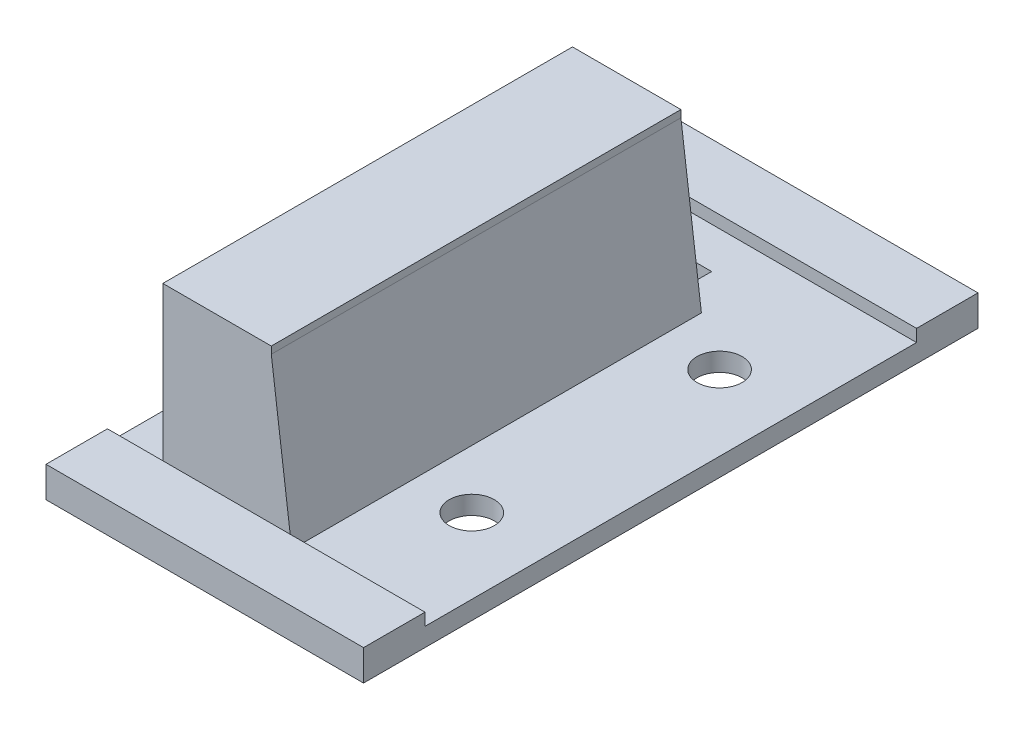
ISO-10303-21;
HEADER;
FILE_DESCRIPTION(('STEP AP214'),'2;1');
FILE_NAME('part.step','',(''),(''),'','','');
FILE_SCHEMA(('AUTOMOTIVE_DESIGN { 1 0 10303 214 1 1 1 1 }'));
ENDSEC;
DATA;
#1=APPLICATION_CONTEXT('core data for automotive mechanical design processes');
#2=APPLICATION_PROTOCOL_DEFINITION('international standard','automotive_design',2000,#1);
#3=PRODUCT_CONTEXT('',#1,'mechanical');
#4=PRODUCT('Part','Part','',(#3));
#5=PRODUCT_RELATED_PRODUCT_CATEGORY('part','',(#4));
#6=PRODUCT_DEFINITION_FORMATION('','',#4);
#7=PRODUCT_DEFINITION_CONTEXT('part definition',#1,'design');
#8=PRODUCT_DEFINITION('design','',#6,#7);
#9=PRODUCT_DEFINITION_SHAPE('','',#8);
#10=(LENGTH_UNIT() NAMED_UNIT(*) SI_UNIT(.MILLI.,.METRE.));
#11=(NAMED_UNIT(*) PLANE_ANGLE_UNIT() SI_UNIT($,.RADIAN.));
#12=(NAMED_UNIT(*) SI_UNIT($,.STERADIAN.) SOLID_ANGLE_UNIT());
#13=UNCERTAINTY_MEASURE_WITH_UNIT(LENGTH_MEASURE(1.E-05),#10,'distance_accuracy_value','');
#14=(GEOMETRIC_REPRESENTATION_CONTEXT(3) GLOBAL_UNCERTAINTY_ASSIGNED_CONTEXT((#13)) GLOBAL_UNIT_ASSIGNED_CONTEXT((#10,
#11,#12)) REPRESENTATION_CONTEXT('',''));
#15=CARTESIAN_POINT('',(0.,0.,0.));
#16=DIRECTION('',(0.,0.,1.));
#17=DIRECTION('',(1.,0.,0.));
#18=AXIS2_PLACEMENT_3D('',#15,#16,#17);
#19=CARTESIAN_POINT('',(0.,0.,-8.509));
#20=DIRECTION('',(0.,0.,-1.));
#21=DIRECTION('',(-1.,0.,0.));
#22=AXIS2_PLACEMENT_3D('',#19,#20,#21);
#23=PLANE('',#22);
#24=DIRECTION('',(0.,1.,0.));
#25=VECTOR('',#24,1.);
#26=CARTESIAN_POINT('',(7.62,0.,-8.509));
#27=LINE('',#26,#25);
#28=CARTESIAN_POINT('',(7.62000000000001,3.81,-8.509));
#29=VERTEX_POINT('',#28);
#30=CARTESIAN_POINT('',(7.62,20.6442671901619,-8.50899999999999));
#31=VERTEX_POINT('',#30);
#32=EDGE_CURVE('E358',#29,#31,#27,.T.);
#33=ORIENTED_EDGE('',*,*,#32,.T.);
#34=DIRECTION('',(0.707106781186557,0.707106781186538,0.));
#35=VECTOR('',#34,1.);
#36=CARTESIAN_POINT('',(-6.51213359508106,6.51213359508124,-8.509));
#37=LINE('',#36,#35);
#38=CARTESIAN_POINT('',(8.94673280983812,21.971,-8.50899999999999));
#39=VERTEX_POINT('',#38);
#40=EDGE_CURVE('E314',#31,#39,#37,.T.);
#41=ORIENTED_EDGE('',*,*,#40,.T.);
#42=DIRECTION('',(1.,0.,0.));
#43=VECTOR('',#42,1.);
#44=CARTESIAN_POINT('',(0.,21.971,-8.509));
#45=LINE('',#44,#43);
#46=CARTESIAN_POINT('',(17.961616695176,21.971,-8.509));
#47=VERTEX_POINT('',#46);
#48=EDGE_CURVE('E365',#39,#47,#45,.T.);
#49=ORIENTED_EDGE('',*,*,#48,.T.);
#50=DIRECTION('',(0.851393399487625,-0.5245276725864,0.));
#51=VECTOR('',#50,1.);
#52=CARTESIAN_POINT('',(14.7535626163669,23.9474225803274,-8.509));
#53=LINE('',#52,#51);
#54=CARTESIAN_POINT('',(19.689000062415,20.9067911656027,-8.509));
#55=VERTEX_POINT('',#54);
#56=EDGE_CURVE('E349',#47,#55,#53,.T.);
#57=ORIENTED_EDGE('',*,*,#56,.T.);
#58=DIRECTION('',(0.127971337630197,-0.991777866634025,0.));
#59=VECTOR('',#58,1.);
#60=CARTESIAN_POINT('',(22.0200318981735,2.841294438474,-8.509));
#61=LINE('',#60,#59);
#62=CARTESIAN_POINT('',(21.8950376321701,3.81,-8.509));
#63=VERTEX_POINT('',#62);
#64=EDGE_CURVE('E367',#55,#63,#61,.T.);
#65=ORIENTED_EDGE('',*,*,#64,.T.);
#66=DIRECTION('',(0.499094844356284,0.866547365316505,0.));
#67=VECTOR('',#66,1.);
#68=CARTESIAN_POINT('',(14.7932943838377,-8.52031551134131,-8.509));
#69=LINE('',#68,#67);
#70=CARTESIAN_POINT('',(21.0172777159293,2.286,-8.509));
#71=VERTEX_POINT('',#70);
#72=EDGE_CURVE('E351',#71,#63,#69,.T.);
#73=ORIENTED_EDGE('',*,*,#72,.F.);
#74=DIRECTION('',(0.,1.,0.));
#75=VECTOR('',#74,1.);
#76=CARTESIAN_POINT('',(21.0172777159293,0.,-8.509));
#77=LINE('',#76,#75);
#78=CARTESIAN_POINT('',(21.0172777159293,0.,-8.509));
#79=VERTEX_POINT('',#78);
#80=EDGE_CURVE('E305',#79,#71,#77,.T.);
#81=ORIENTED_EDGE('',*,*,#80,.F.);
#82=DIRECTION('',(1.,0.,0.));
#83=VECTOR('',#82,1.);
#84=CARTESIAN_POINT('',(21.0172777159293,0.,-8.509));
#85=LINE('',#84,#83);
#86=CARTESIAN_POINT('',(9.14399999999998,0.,-8.509));
#87=VERTEX_POINT('',#86);
#88=EDGE_CURVE('E281',#87,#79,#85,.T.);
#89=ORIENTED_EDGE('',*,*,#88,.F.);
#90=DIRECTION('',(0.,1.,0.));
#91=VECTOR('',#90,1.);
#92=CARTESIAN_POINT('',(9.14399999999998,0.,-8.509));
#93=LINE('',#92,#91);
#94=CARTESIAN_POINT('',(9.14399999999998,2.286,-8.509));
#95=VERTEX_POINT('',#94);
#96=EDGE_CURVE('E307',#87,#95,#93,.T.);
#97=ORIENTED_EDGE('',*,*,#96,.T.);
#98=DIRECTION('',(-0.707106781186542,0.707106781186553,0.));
#99=VECTOR('',#98,1.);
#100=CARTESIAN_POINT('',(5.71500000000006,5.71499999999997,-8.509));
#101=LINE('',#100,#99);
#102=EDGE_CURVE('E91',#95,#29,#101,.T.);
#103=ORIENTED_EDGE('',*,*,#102,.T.);
#104=EDGE_LOOP('',(#33,#41,#49,#57,#65,#73,#81,#89,#97,#103));
#105=FACE_BOUND('',#104,.T.);
#106=ADVANCED_FACE('F83',(#105),#23,.T.);
#107=CARTESIAN_POINT('',(20.32,21.971,-58.42));
#108=DIRECTION('',(0.,1.,0.));
#109=DIRECTION('',(0.,0.,1.));
#110=AXIS2_PLACEMENT_3D('',#107,#108,#109);
#111=PLANE('',#110);
#112=DIRECTION('',(0.,0.,1.));
#113=VECTOR('',#112,1.);
#114=CARTESIAN_POINT('',(8.94673280983812,21.971,-78.705299702025));
#115=LINE('',#114,#113);
#116=CARTESIAN_POINT('',(8.94673280983812,21.971,-58.42));
#117=VERTEX_POINT('',#116);
#118=EDGE_CURVE('E312',#117,#39,#115,.T.);
#119=ORIENTED_EDGE('',*,*,#118,.F.);
#120=DIRECTION('',(-1.,0.,0.));
#121=VECTOR('',#120,1.);
#122=CARTESIAN_POINT('',(20.32,21.971,-58.42));
#123=LINE('',#122,#121);
#124=CARTESIAN_POINT('',(17.961616695176,21.971,-58.42));
#125=VERTEX_POINT('',#124);
#126=EDGE_CURVE('E379',#125,#117,#123,.T.);
#127=ORIENTED_EDGE('',*,*,#126,.F.);
#128=DIRECTION('',(0.,0.,1.));
#129=VECTOR('',#128,1.);
#130=CARTESIAN_POINT('',(17.961616695176,21.971,-78.705299702025));
#131=LINE('',#130,#129);
#132=EDGE_CURVE('E325',#125,#47,#131,.T.);
#133=ORIENTED_EDGE('',*,*,#132,.T.);
#134=ORIENTED_EDGE('',*,*,#48,.F.);
#135=EDGE_LOOP('',(#119,#127,#133,#134));
#136=FACE_BOUND('',#135,.T.);
#137=ADVANCED_FACE('F474',(#136),#111,.F.);
#138=CARTESIAN_POINT('',(7.62000000000001,22.86,0.));
#139=DIRECTION('',(1.,0.,0.));
#140=DIRECTION('',(0.,0.,-1.));
#141=AXIS2_PLACEMENT_3D('',#138,#139,#140);
#142=PLANE('',#141);
#143=DIRECTION('',(0.,-1.,0.));
#144=VECTOR('',#143,1.);
#145=CARTESIAN_POINT('',(7.62,22.86,-58.42));
#146=LINE('',#145,#144);
#147=CARTESIAN_POINT('',(7.62,20.6442671901619,-58.42));
#148=VERTEX_POINT('',#147);
#149=CARTESIAN_POINT('',(7.62,3.81,-58.42));
#150=VERTEX_POINT('',#149);
#151=EDGE_CURVE('E391',#148,#150,#146,.T.);
#152=ORIENTED_EDGE('',*,*,#151,.F.);
#153=DIRECTION('',(0.,0.,1.));
#154=VECTOR('',#153,1.);
#155=CARTESIAN_POINT('',(7.62,20.6442671901619,-78.705299702025));
#156=LINE('',#155,#154);
#157=EDGE_CURVE('E315',#148,#31,#156,.T.);
#158=ORIENTED_EDGE('',*,*,#157,.T.);
#159=ORIENTED_EDGE('',*,*,#32,.F.);
#160=DIRECTION('',(0.,0.,1.));
#161=VECTOR('',#160,1.);
#162=CARTESIAN_POINT('',(7.62,3.81,-78.705299702025));
#163=LINE('',#162,#161);
#164=EDGE_CURVE('E354',#150,#29,#163,.T.);
#165=ORIENTED_EDGE('',*,*,#164,.F.);
#166=EDGE_LOOP('',(#152,#158,#159,#165));
#167=FACE_BOUND('',#166,.T.);
#168=ADVANCED_FACE('F468',(#167),#142,.T.);
#169=CARTESIAN_POINT('',(0.,3.81,-7.62));
#170=DIRECTION('',(0.,0.,1.));
#171=DIRECTION('',(1.,0.,0.));
#172=AXIS2_PLACEMENT_3D('',#169,#170,#171);
#173=PLANE('',#172);
#174=DIRECTION('',(0.127971337630197,-0.991777866634025,0.));
#175=VECTOR('',#174,1.);
#176=CARTESIAN_POINT('',(22.7757666325486,2.93880859774821,-7.62));
#177=LINE('',#176,#175);
#178=CARTESIAN_POINT('',(22.6633548387097,3.81,-7.62));
#179=VERTEX_POINT('',#178);
#180=CARTESIAN_POINT('',(22.86,2.286,-7.62));
#181=VERTEX_POINT('',#180);
#182=EDGE_CURVE('E326',#179,#181,#177,.T.);
#183=ORIENTED_EDGE('',*,*,#182,.F.);
#184=DIRECTION('',(-1.,0.,0.));
#185=VECTOR('',#184,1.);
#186=CARTESIAN_POINT('',(0.,3.81,-7.62));
#187=LINE('',#186,#185);
#188=CARTESIAN_POINT('',(39.3827,3.81,-7.62));
#189=VERTEX_POINT('',#188);
#190=EDGE_CURVE('E528',#189,#179,#187,.T.);
#191=ORIENTED_EDGE('',*,*,#190,.F.);
#192=DIRECTION('',(0.,-1.,0.));
#193=VECTOR('',#192,1.);
#194=CARTESIAN_POINT('',(39.3827,3.81,-7.62));
#195=LINE('',#194,#193);
#196=CARTESIAN_POINT('',(39.3827,2.286,-7.62));
#197=VERTEX_POINT('',#196);
#198=EDGE_CURVE('E458',#189,#197,#195,.T.);
#199=ORIENTED_EDGE('',*,*,#198,.T.);
#200=DIRECTION('',(-1.,0.,0.));
#201=VECTOR('',#200,1.);
#202=CARTESIAN_POINT('',(0.,2.286,-7.62));
#203=LINE('',#202,#201);
#204=EDGE_CURVE('E453',#197,#181,#203,.T.);
#205=ORIENTED_EDGE('',*,*,#204,.T.);
#206=EDGE_LOOP('',(#183,#191,#199,#205));
#207=FACE_BOUND('',#206,.T.);
#208=ADVANCED_FACE('F526',(#207),#173,.F.);
#209=CARTESIAN_POINT('',(0.,2.286,0.));
#210=DIRECTION('',(0.,1.,0.));
#211=DIRECTION('',(0.,0.,1.));
#212=AXIS2_PLACEMENT_3D('',#209,#210,#211);
#213=PLANE('',#212);
#214=DIRECTION('',(-1.,0.,0.));
#215=VECTOR('',#214,1.);
#216=CARTESIAN_POINT('',(9.14399999999998,2.286,-58.42));
#217=LINE('',#216,#215);
#218=CARTESIAN_POINT('',(21.0172777159293,2.286,-58.42));
#219=VERTEX_POINT('',#218);
#220=CARTESIAN_POINT('',(19.05,2.286,-58.42));
#221=VERTEX_POINT('',#220);
#222=EDGE_CURVE('E297',#219,#221,#217,.T.);
#223=ORIENTED_EDGE('',*,*,#222,.F.);
#224=DIRECTION('',(-1.,0.,0.));
#225=VECTOR('',#224,1.);
#226=CARTESIAN_POINT('',(0.,2.286,-58.42));
#227=LINE('',#226,#225);
#228=CARTESIAN_POINT('',(22.86,2.286,-58.42));
#229=VERTEX_POINT('',#228);
#230=EDGE_CURVE('E106',#229,#219,#227,.T.);
#231=ORIENTED_EDGE('',*,*,#230,.F.);
#232=DIRECTION('',(0.,0.,1.));
#233=VECTOR('',#232,1.);
#234=CARTESIAN_POINT('',(22.86,2.286,-78.705299702025));
#235=LINE('',#234,#233);
#236=EDGE_CURVE('E344',#229,#181,#235,.T.);
#237=ORIENTED_EDGE('',*,*,#236,.T.);
#238=ORIENTED_EDGE('',*,*,#204,.F.);
#239=DIRECTION('',(0.,0.,-1.));
#240=VECTOR('',#239,1.);
#241=CARTESIAN_POINT('',(39.3827,2.286,0.));
#242=LINE('',#241,#240);
#243=CARTESIAN_POINT('',(39.3827,2.286,-68.58));
#244=VERTEX_POINT('',#243);
#245=EDGE_CURVE('E571',#197,#244,#242,.T.);
#246=ORIENTED_EDGE('',*,*,#245,.T.);
#247=DIRECTION('',(-1.,0.,0.));
#248=VECTOR('',#247,1.);
#249=CARTESIAN_POINT('',(0.,2.286,-68.58));
#250=LINE('',#249,#248);
#251=CARTESIAN_POINT('',(0.,2.286,-68.58));
#252=VERTEX_POINT('',#251);
#253=EDGE_CURVE('E440',#244,#252,#250,.T.);
#254=ORIENTED_EDGE('',*,*,#253,.T.);
#255=DIRECTION('',(0.,0.,-1.));
#256=VECTOR('',#255,1.);
#257=CARTESIAN_POINT('',(0.,2.286,0.));
#258=LINE('',#257,#256);
#259=CARTESIAN_POINT('',(0.,2.286,-7.62));
#260=VERTEX_POINT('',#259);
#261=EDGE_CURVE('E565',#260,#252,#258,.T.);
#262=ORIENTED_EDGE('',*,*,#261,.F.);
#263=CARTESIAN_POINT('',(6.87000000000001,2.286,-7.62));
#264=VERTEX_POINT('',#263);
#265=EDGE_CURVE('E449',#264,#260,#203,.T.);
#266=ORIENTED_EDGE('',*,*,#265,.F.);
#267=DIRECTION('',(0.,0.,-1.));
#268=VECTOR('',#267,1.);
#269=CARTESIAN_POINT('',(6.87000000000001,2.286,0.));
#270=LINE('',#269,#268);
#271=CARTESIAN_POINT('',(6.87,2.286,-58.42));
#272=VERTEX_POINT('',#271);
#273=EDGE_CURVE('E457',#264,#272,#270,.T.);
#274=ORIENTED_EDGE('',*,*,#273,.T.);
#275=DIRECTION('',(-1.,0.,0.));
#276=VECTOR('',#275,1.);
#277=CARTESIAN_POINT('',(0.,2.286,-58.42));
#278=LINE('',#277,#276);
#279=CARTESIAN_POINT('',(9.14399999999998,2.286,-58.42));
#280=VERTEX_POINT('',#279);
#281=EDGE_CURVE('E454',#280,#272,#278,.T.);
#282=ORIENTED_EDGE('',*,*,#281,.F.);
#283=CARTESIAN_POINT('',(11.176,2.286,-58.42));
#284=VERTEX_POINT('',#283);
#285=EDGE_CURVE('E300',#284,#280,#217,.T.);
#286=ORIENTED_EDGE('',*,*,#285,.F.);
#287=DIRECTION('',(0.,0.,1.));
#288=VECTOR('',#287,1.);
#289=CARTESIAN_POINT('',(11.176,2.286,0.));
#290=LINE('',#289,#288);
#291=CARTESIAN_POINT('',(11.176,2.286,-63.5));
#292=VERTEX_POINT('',#291);
#293=EDGE_CURVE('E434',#292,#284,#290,.T.);
#294=ORIENTED_EDGE('',*,*,#293,.F.);
#295=DIRECTION('',(-1.,0.,0.));
#296=VECTOR('',#295,1.);
#297=CARTESIAN_POINT('',(0.,2.286,-63.5));
#298=LINE('',#297,#296);
#299=CARTESIAN_POINT('',(19.05,2.286,-63.5));
#300=VERTEX_POINT('',#299);
#301=EDGE_CURVE('E437',#300,#292,#298,.T.);
#302=ORIENTED_EDGE('',*,*,#301,.F.);
#303=DIRECTION('',(0.,0.,-1.));
#304=VECTOR('',#303,1.);
#305=CARTESIAN_POINT('',(19.05,2.286,0.));
#306=LINE('',#305,#304);
#307=EDGE_CURVE('E432',#221,#300,#306,.T.);
#308=ORIENTED_EDGE('',*,*,#307,.F.);
#309=EDGE_LOOP('',(#223,#231,#237,#238,#246,#254,#262,#266,#274,#282,#286,#294,#302,#308));
#310=FACE_BOUND('',#309,.T.);
#311=CARTESIAN_POINT('',(30.0679322618683,2.286,-53.467));
#312=DIRECTION('',(0.,1.,0.));
#313=DIRECTION('',(0.,0.,1.));
#314=AXIS2_PLACEMENT_3D('',#311,#312,#313);
#315=CIRCLE('',#314,2.794);
#316=CARTESIAN_POINT('',(30.0679322618683,2.286,-50.673));
#317=VERTEX_POINT('',#316);
#318=EDGE_CURVE('E428',#317,#317,#315,.T.);
#319=ORIENTED_EDGE('',*,*,#318,.F.);
#320=EDGE_LOOP('',(#319));
#321=FACE_BOUND('',#320,.T.);
#322=CARTESIAN_POINT('',(30.0679322618683,2.286,-22.733));
#323=DIRECTION('',(0.,1.,0.));
#324=DIRECTION('',(0.,0.,1.));
#325=AXIS2_PLACEMENT_3D('',#322,#323,#324);
#326=CIRCLE('',#325,2.79399999999999);
#327=CARTESIAN_POINT('',(30.0679322618683,2.286,-19.939));
#328=VERTEX_POINT('',#327);
#329=EDGE_CURVE('E425',#328,#328,#326,.T.);
#330=ORIENTED_EDGE('',*,*,#329,.F.);
#331=EDGE_LOOP('',(#330));
#332=FACE_BOUND('',#331,.T.);
#333=ADVANCED_FACE('F638',(#310,#321,#332),#213,.T.);
#334=DIRECTION('',(0.,-1.,0.));
#335=VECTOR('',#334,1.);
#336=CARTESIAN_POINT('',(6.87000000000001,22.86,-7.62));
#337=LINE('',#336,#335);
#338=CARTESIAN_POINT('',(6.87000000000001,3.81,-7.62));
#339=VERTEX_POINT('',#338);
#340=EDGE_CURVE('E393',#339,#264,#337,.T.);
#341=ORIENTED_EDGE('',*,*,#340,.T.);
#342=ORIENTED_EDGE('',*,*,#265,.T.);
#343=DIRECTION('',(0.,-1.,0.));
#344=VECTOR('',#343,1.);
#345=CARTESIAN_POINT('',(0.,3.81,-7.62));
#346=LINE('',#345,#344);
#347=CARTESIAN_POINT('',(0.,3.81,-7.62));
#348=VERTEX_POINT('',#347);
#349=EDGE_CURVE('E557',#348,#260,#346,.T.);
#350=ORIENTED_EDGE('',*,*,#349,.F.);
#351=EDGE_CURVE('E536',#339,#348,#187,.T.);
#352=ORIENTED_EDGE('',*,*,#351,.F.);
#353=EDGE_LOOP('',(#341,#342,#350,#352));
#354=FACE_BOUND('',#353,.T.);
#355=ADVANCED_FACE('F641',(#354),#173,.F.);
#356=CARTESIAN_POINT('',(39.3827,3.81,0.));
#357=DIRECTION('',(-1.,0.,0.));
#358=DIRECTION('',(0.,0.,1.));
#359=AXIS2_PLACEMENT_3D('',#356,#357,#358);
#360=PLANE('',#359);
#361=DIRECTION('',(0.,0.,-1.));
#362=VECTOR('',#361,1.);
#363=CARTESIAN_POINT('',(39.3827,0.,0.));
#364=LINE('',#363,#362);
#365=CARTESIAN_POINT('',(39.3827,0.,0.));
#366=VERTEX_POINT('',#365);
#367=CARTESIAN_POINT('',(39.3827,0.,-76.2));
#368=VERTEX_POINT('',#367);
#369=EDGE_CURVE('E546',#366,#368,#364,.T.);
#370=ORIENTED_EDGE('',*,*,#369,.T.);
#371=DIRECTION('',(0.,-1.,0.));
#372=VECTOR('',#371,1.);
#373=CARTESIAN_POINT('',(39.3827,3.81,-76.2));
#374=LINE('',#373,#372);
#375=CARTESIAN_POINT('',(39.3827,3.81,-76.2));
#376=VERTEX_POINT('',#375);
#377=EDGE_CURVE('E944',#376,#368,#374,.T.);
#378=ORIENTED_EDGE('',*,*,#377,.F.);
#379=DIRECTION('',(0.,0.,-1.));
#380=VECTOR('',#379,1.);
#381=CARTESIAN_POINT('',(39.3827,3.81,0.));
#382=LINE('',#381,#380);
#383=CARTESIAN_POINT('',(39.3827,3.81,-68.58));
#384=VERTEX_POINT('',#383);
#385=EDGE_CURVE('E405',#384,#376,#382,.T.);
#386=ORIENTED_EDGE('',*,*,#385,.F.);
#387=DIRECTION('',(0.,-1.,0.));
#388=VECTOR('',#387,1.);
#389=CARTESIAN_POINT('',(39.3827,3.81,-68.58));
#390=LINE('',#389,#388);
#391=EDGE_CURVE('E423',#384,#244,#390,.T.);
#392=ORIENTED_EDGE('',*,*,#391,.T.);
#393=ORIENTED_EDGE('',*,*,#245,.F.);
#394=ORIENTED_EDGE('',*,*,#198,.F.);
#395=DIRECTION('',(0.,0.,-1.));
#396=VECTOR('',#395,1.);
#397=CARTESIAN_POINT('',(39.3827,3.81,0.));
#398=LINE('',#397,#396);
#399=CARTESIAN_POINT('',(39.3827,3.81,0.));
#400=VERTEX_POINT('',#399);
#401=EDGE_CURVE('E533',#400,#189,#398,.T.);
#402=ORIENTED_EDGE('',*,*,#401,.F.);
#403=DIRECTION('',(0.,-1.,0.));
#404=VECTOR('',#403,1.);
#405=CARTESIAN_POINT('',(39.3827,3.81,0.));
#406=LINE('',#405,#404);
#407=EDGE_CURVE('E545',#400,#366,#406,.T.);
#408=ORIENTED_EDGE('',*,*,#407,.T.);
#409=EDGE_LOOP('',(#370,#378,#386,#392,#393,#394,#402,#408));
#410=FACE_BOUND('',#409,.T.);
#411=ADVANCED_FACE('F85',(#410),#360,.F.);
#412=CARTESIAN_POINT('',(0.,3.81,0.));
#413=DIRECTION('',(-1.,0.,0.));
#414=DIRECTION('',(0.,0.,1.));
#415=AXIS2_PLACEMENT_3D('',#412,#413,#414);
#416=PLANE('',#415);
#417=DIRECTION('',(0.,0.,-1.));
#418=VECTOR('',#417,1.);
#419=CARTESIAN_POINT('',(0.,0.,0.));
#420=LINE('',#419,#418);
#421=CARTESIAN_POINT('',(0.,0.,0.));
#422=VERTEX_POINT('',#421);
#423=CARTESIAN_POINT('',(0.,0.,-76.2));
#424=VERTEX_POINT('',#423);
#425=EDGE_CURVE('E548',#422,#424,#420,.T.);
#426=ORIENTED_EDGE('',*,*,#425,.F.);
#427=DIRECTION('',(0.,-1.,0.));
#428=VECTOR('',#427,1.);
#429=CARTESIAN_POINT('',(0.,3.81,0.));
#430=LINE('',#429,#428);
#431=CARTESIAN_POINT('',(0.,3.81,0.));
#432=VERTEX_POINT('',#431);
#433=EDGE_CURVE('E555',#432,#422,#430,.T.);
#434=ORIENTED_EDGE('',*,*,#433,.F.);
#435=DIRECTION('',(0.,0.,-1.));
#436=VECTOR('',#435,1.);
#437=CARTESIAN_POINT('',(0.,3.81,0.));
#438=LINE('',#437,#436);
#439=EDGE_CURVE('E535',#432,#348,#438,.T.);
#440=ORIENTED_EDGE('',*,*,#439,.T.);
#441=ORIENTED_EDGE('',*,*,#349,.T.);
#442=ORIENTED_EDGE('',*,*,#261,.T.);
#443=DIRECTION('',(0.,-1.,0.));
#444=VECTOR('',#443,1.);
#445=CARTESIAN_POINT('',(0.,3.81,-68.58));
#446=LINE('',#445,#444);
#447=CARTESIAN_POINT('',(0.,3.81,-68.58));
#448=VERTEX_POINT('',#447);
#449=EDGE_CURVE('E413',#448,#252,#446,.T.);
#450=ORIENTED_EDGE('',*,*,#449,.F.);
#451=DIRECTION('',(0.,0.,-1.));
#452=VECTOR('',#451,1.);
#453=CARTESIAN_POINT('',(0.,3.81,0.));
#454=LINE('',#453,#452);
#455=CARTESIAN_POINT('',(0.,3.81,-76.2));
#456=VERTEX_POINT('',#455);
#457=EDGE_CURVE('E410',#448,#456,#454,.T.);
#458=ORIENTED_EDGE('',*,*,#457,.T.);
#459=DIRECTION('',(0.,-1.,0.));
#460=VECTOR('',#459,1.);
#461=CARTESIAN_POINT('',(0.,3.81,-76.2));
#462=LINE('',#461,#460);
#463=EDGE_CURVE('E418',#456,#424,#462,.T.);
#464=ORIENTED_EDGE('',*,*,#463,.T.);
#465=EDGE_LOOP('',(#426,#434,#440,#441,#442,#450,#458,#464));
#466=FACE_BOUND('',#465,.T.);
#467=ADVANCED_FACE('F752',(#466),#416,.T.);
#468=CARTESIAN_POINT('',(0.,3.81,0.));
#469=DIRECTION('',(0.,0.,-1.));
#470=DIRECTION('',(-1.,0.,0.));
#471=AXIS2_PLACEMENT_3D('',#468,#469,#470);
#472=PLANE('',#471);
#473=DIRECTION('',(1.,0.,0.));
#474=VECTOR('',#473,1.);
#475=CARTESIAN_POINT('',(0.,0.,0.));
#476=LINE('',#475,#474);
#477=EDGE_CURVE('E551',#422,#366,#476,.T.);
#478=ORIENTED_EDGE('',*,*,#477,.T.);
#479=ORIENTED_EDGE('',*,*,#407,.F.);
#480=DIRECTION('',(1.,0.,0.));
#481=VECTOR('',#480,1.);
#482=CARTESIAN_POINT('',(0.,3.81,0.));
#483=LINE('',#482,#481);
#484=EDGE_CURVE('E539',#432,#400,#483,.T.);
#485=ORIENTED_EDGE('',*,*,#484,.F.);
#486=ORIENTED_EDGE('',*,*,#433,.T.);
#487=EDGE_LOOP('',(#478,#479,#485,#486));
#488=FACE_BOUND('',#487,.T.);
#489=ADVANCED_FACE('F757',(#488),#472,.F.);
#490=CARTESIAN_POINT('',(0.,3.81,0.));
#491=DIRECTION('',(0.,1.,0.));
#492=DIRECTION('',(0.,0.,1.));
#493=AXIS2_PLACEMENT_3D('',#490,#491,#492);
#494=PLANE('',#493);
#495=ORIENTED_EDGE('',*,*,#401,.T.);
#496=ORIENTED_EDGE('',*,*,#190,.T.);
#497=DIRECTION('',(1.,0.,0.));
#498=VECTOR('',#497,1.);
#499=CARTESIAN_POINT('',(0.,3.81,-7.62));
#500=LINE('',#499,#498);
#501=CARTESIAN_POINT('',(7.62,3.81,-7.62));
#502=VERTEX_POINT('',#501);
#503=EDGE_CURVE('E397',#502,#179,#500,.T.);
#504=ORIENTED_EDGE('',*,*,#503,.F.);
#505=EDGE_CURVE('E398',#339,#502,#500,.T.);
#506=ORIENTED_EDGE('',*,*,#505,.F.);
#507=ORIENTED_EDGE('',*,*,#351,.T.);
#508=ORIENTED_EDGE('',*,*,#439,.F.);
#509=ORIENTED_EDGE('',*,*,#484,.T.);
#510=EDGE_LOOP('',(#495,#496,#504,#506,#507,#508,#509));
#511=FACE_BOUND('',#510,.T.);
#512=ADVANCED_FACE('F531',(#511),#494,.T.);
#513=CARTESIAN_POINT('',(0.,0.,0.));
#514=DIRECTION('',(0.,1.,0.));
#515=DIRECTION('',(0.,0.,1.));
#516=AXIS2_PLACEMENT_3D('',#513,#514,#515);
#517=PLANE('',#516);
#518=DIRECTION('',(0.,0.,-1.));
#519=VECTOR('',#518,1.);
#520=CARTESIAN_POINT('',(21.0172777159293,0.,-58.42));
#521=LINE('',#520,#519);
#522=CARTESIAN_POINT('',(21.0172777159293,0.,-58.42));
#523=VERTEX_POINT('',#522);
#524=EDGE_CURVE('E275',#79,#523,#521,.T.);
#525=ORIENTED_EDGE('',*,*,#524,.T.);
#526=DIRECTION('',(-1.,0.,0.));
#527=VECTOR('',#526,1.);
#528=CARTESIAN_POINT('',(9.14399999999998,0.,-58.42));
#529=LINE('',#528,#527);
#530=CARTESIAN_POINT('',(19.05,0.,-58.42));
#531=VERTEX_POINT('',#530);
#532=EDGE_CURVE('E284',#523,#531,#529,.T.);
#533=ORIENTED_EDGE('',*,*,#532,.T.);
#534=DIRECTION('',(0.,0.,-1.));
#535=VECTOR('',#534,1.);
#536=CARTESIAN_POINT('',(19.05,0.,0.));
#537=LINE('',#536,#535);
#538=CARTESIAN_POINT('',(19.05,0.,-63.5));
#539=VERTEX_POINT('',#538);
#540=EDGE_CURVE('E584',#531,#539,#537,.T.);
#541=ORIENTED_EDGE('',*,*,#540,.T.);
#542=DIRECTION('',(-1.,0.,0.));
#543=VECTOR('',#542,1.);
#544=CARTESIAN_POINT('',(0.,0.,-63.5));
#545=LINE('',#544,#543);
#546=CARTESIAN_POINT('',(11.176,0.,-63.5));
#547=VERTEX_POINT('',#546);
#548=EDGE_CURVE('E429',#539,#547,#545,.T.);
#549=ORIENTED_EDGE('',*,*,#548,.T.);
#550=DIRECTION('',(0.,0.,1.));
#551=VECTOR('',#550,1.);
#552=CARTESIAN_POINT('',(11.176,0.,0.));
#553=LINE('',#552,#551);
#554=CARTESIAN_POINT('',(11.176,0.,-58.42));
#555=VERTEX_POINT('',#554);
#556=EDGE_CURVE('E582',#547,#555,#553,.T.);
#557=ORIENTED_EDGE('',*,*,#556,.T.);
#558=CARTESIAN_POINT('',(9.14399999999998,0.,-58.42));
#559=VERTEX_POINT('',#558);
#560=EDGE_CURVE('E291',#555,#559,#529,.T.);
#561=ORIENTED_EDGE('',*,*,#560,.T.);
#562=DIRECTION('',(0.,0.,1.));
#563=VECTOR('',#562,1.);
#564=CARTESIAN_POINT('',(9.14399999999998,0.,-8.509));
#565=LINE('',#564,#563);
#566=EDGE_CURVE('E290',#559,#87,#565,.T.);
#567=ORIENTED_EDGE('',*,*,#566,.T.);
#568=ORIENTED_EDGE('',*,*,#88,.T.);
#569=EDGE_LOOP('',(#525,#533,#541,#549,#557,#561,#567,#568));
#570=FACE_BOUND('',#569,.T.);
#571=CARTESIAN_POINT('',(30.0679322618683,0.,-53.467));
#572=DIRECTION('',(0.,1.,0.));
#573=DIRECTION('',(0.,0.,1.));
#574=AXIS2_PLACEMENT_3D('',#571,#572,#573);
#575=CIRCLE('',#574,2.794);
#576=CARTESIAN_POINT('',(30.0679322618683,0.,-50.673));
#577=VERTEX_POINT('',#576);
#578=EDGE_CURVE('E586',#577,#577,#575,.T.);
#579=ORIENTED_EDGE('',*,*,#578,.T.);
#580=EDGE_LOOP('',(#579));
#581=FACE_BOUND('',#580,.T.);
#582=CARTESIAN_POINT('',(30.0679322618683,0.,-22.733));
#583=DIRECTION('',(0.,1.,0.));
#584=DIRECTION('',(0.,0.,1.));
#585=AXIS2_PLACEMENT_3D('',#582,#583,#584);
#586=CIRCLE('',#585,2.79399999999999);
#587=CARTESIAN_POINT('',(30.0679322618683,0.,-19.939));
#588=VERTEX_POINT('',#587);
#589=EDGE_CURVE('E568',#588,#588,#586,.T.);
#590=ORIENTED_EDGE('',*,*,#589,.T.);
#591=EDGE_LOOP('',(#590));
#592=FACE_BOUND('',#591,.T.);
#593=ORIENTED_EDGE('',*,*,#369,.F.);
#594=ORIENTED_EDGE('',*,*,#477,.F.);
#595=ORIENTED_EDGE('',*,*,#425,.T.);
#596=DIRECTION('',(1.,0.,0.));
#597=VECTOR('',#596,1.);
#598=CARTESIAN_POINT('',(0.,0.,-76.2));
#599=LINE('',#598,#597);
#600=EDGE_CURVE('E401',#424,#368,#599,.T.);
#601=ORIENTED_EDGE('',*,*,#600,.T.);
#602=EDGE_LOOP('',(#593,#594,#595,#601));
#603=FACE_BOUND('',#602,.T.);
#604=ADVANCED_FACE('F293',(#570,#581,#592,#603),#517,.F.);
#605=CARTESIAN_POINT('',(19.05,2.286,0.));
#606=DIRECTION('',(-1.,0.,0.));
#607=DIRECTION('',(0.,0.,1.));
#608=AXIS2_PLACEMENT_3D('',#605,#606,#607);
#609=PLANE('',#608);
#610=DIRECTION('',(0.,-1.,0.));
#611=VECTOR('',#610,1.);
#612=CARTESIAN_POINT('',(19.05,2.286,-58.42));
#613=LINE('',#612,#611);
#614=EDGE_CURVE('E287',#221,#531,#613,.T.);
#615=ORIENTED_EDGE('',*,*,#614,.F.);
#616=ORIENTED_EDGE('',*,*,#307,.T.);
#617=DIRECTION('',(0.,-1.,0.));
#618=VECTOR('',#617,1.);
#619=CARTESIAN_POINT('',(19.05,2.286,-63.5));
#620=LINE('',#619,#618);
#621=EDGE_CURVE('E573',#300,#539,#620,.T.);
#622=ORIENTED_EDGE('',*,*,#621,.T.);
#623=ORIENTED_EDGE('',*,*,#540,.F.);
#624=EDGE_LOOP('',(#615,#616,#622,#623));
#625=FACE_BOUND('',#624,.T.);
#626=ADVANCED_FACE('F648',(#625),#609,.T.);
#627=CARTESIAN_POINT('',(11.176,2.286,0.));
#628=DIRECTION('',(1.,0.,0.));
#629=DIRECTION('',(0.,0.,-1.));
#630=AXIS2_PLACEMENT_3D('',#627,#628,#629);
#631=PLANE('',#630);
#632=DIRECTION('',(0.,1.,0.));
#633=VECTOR('',#632,1.);
#634=CARTESIAN_POINT('',(11.176,2.286,-58.42));
#635=LINE('',#634,#633);
#636=EDGE_CURVE('E12',#555,#284,#635,.T.);
#637=ORIENTED_EDGE('',*,*,#636,.F.);
#638=ORIENTED_EDGE('',*,*,#556,.F.);
#639=DIRECTION('',(0.,-1.,0.));
#640=VECTOR('',#639,1.);
#641=CARTESIAN_POINT('',(11.176,2.286,-63.5));
#642=LINE('',#641,#640);
#643=EDGE_CURVE('E549',#292,#547,#642,.T.);
#644=ORIENTED_EDGE('',*,*,#643,.F.);
#645=ORIENTED_EDGE('',*,*,#293,.T.);
#646=EDGE_LOOP('',(#637,#638,#644,#645));
#647=FACE_BOUND('',#646,.T.);
#648=ADVANCED_FACE('F644',(#647),#631,.T.);
#649=CARTESIAN_POINT('',(0.,2.286,-63.5));
#650=DIRECTION('',(0.,0.,1.));
#651=DIRECTION('',(1.,0.,0.));
#652=AXIS2_PLACEMENT_3D('',#649,#650,#651);
#653=PLANE('',#652);
#654=ORIENTED_EDGE('',*,*,#548,.F.);
#655=ORIENTED_EDGE('',*,*,#621,.F.);
#656=ORIENTED_EDGE('',*,*,#301,.T.);
#657=ORIENTED_EDGE('',*,*,#643,.T.);
#658=EDGE_LOOP('',(#654,#655,#656,#657));
#659=FACE_BOUND('',#658,.T.);
#660=ADVANCED_FACE('F606',(#659),#653,.T.);
#661=CARTESIAN_POINT('',(30.0679322618683,2.286,-53.467));
#662=DIRECTION('',(0.,-1.,0.));
#663=DIRECTION('',(0.,0.,-1.));
#664=AXIS2_PLACEMENT_3D('',#661,#662,#663);
#665=CYLINDRICAL_SURFACE('',#664,2.794);
#666=ORIENTED_EDGE('',*,*,#318,.T.);
#667=EDGE_LOOP('',(#666));
#668=FACE_BOUND('',#667,.T.);
#669=ORIENTED_EDGE('',*,*,#578,.F.);
#670=EDGE_LOOP('',(#669));
#671=FACE_BOUND('',#670,.T.);
#672=ADVANCED_FACE('F596',(#668,#671),#665,.F.);
#673=CARTESIAN_POINT('',(30.0679322618683,2.286,-22.733));
#674=DIRECTION('',(0.,-1.,0.));
#675=DIRECTION('',(0.,0.,-1.));
#676=AXIS2_PLACEMENT_3D('',#673,#674,#675);
#677=CYLINDRICAL_SURFACE('',#676,2.79399999999999);
#678=ORIENTED_EDGE('',*,*,#329,.T.);
#679=EDGE_LOOP('',(#678));
#680=FACE_BOUND('',#679,.T.);
#681=ORIENTED_EDGE('',*,*,#589,.F.);
#682=EDGE_LOOP('',(#681));
#683=FACE_BOUND('',#682,.T.);
#684=ADVANCED_FACE('F593',(#680,#683),#677,.F.);
#685=CARTESIAN_POINT('',(0.,3.81,-68.58));
#686=DIRECTION('',(0.,0.,1.));
#687=DIRECTION('',(1.,0.,0.));
#688=AXIS2_PLACEMENT_3D('',#685,#686,#687);
#689=PLANE('',#688);
#690=ORIENTED_EDGE('',*,*,#253,.F.);
#691=ORIENTED_EDGE('',*,*,#391,.F.);
#692=DIRECTION('',(-1.,0.,0.));
#693=VECTOR('',#692,1.);
#694=CARTESIAN_POINT('',(0.,3.81,-68.58));
#695=LINE('',#694,#693);
#696=EDGE_CURVE('E402',#384,#448,#695,.T.);
#697=ORIENTED_EDGE('',*,*,#696,.T.);
#698=ORIENTED_EDGE('',*,*,#449,.T.);
#699=EDGE_LOOP('',(#690,#691,#697,#698));
#700=FACE_BOUND('',#699,.T.);
#701=ADVANCED_FACE('F595',(#700),#689,.T.);
#702=CARTESIAN_POINT('',(0.,3.81,-76.2));
#703=DIRECTION('',(0.,0.,-1.));
#704=DIRECTION('',(-1.,0.,0.));
#705=AXIS2_PLACEMENT_3D('',#702,#703,#704);
#706=PLANE('',#705);
#707=ORIENTED_EDGE('',*,*,#600,.F.);
#708=ORIENTED_EDGE('',*,*,#463,.F.);
#709=DIRECTION('',(1.,0.,0.));
#710=VECTOR('',#709,1.);
#711=CARTESIAN_POINT('',(0.,3.81,-76.2));
#712=LINE('',#711,#710);
#713=EDGE_CURVE('E407',#456,#376,#712,.T.);
#714=ORIENTED_EDGE('',*,*,#713,.T.);
#715=ORIENTED_EDGE('',*,*,#377,.T.);
#716=EDGE_LOOP('',(#707,#708,#714,#715));
#717=FACE_BOUND('',#716,.T.);
#718=ADVANCED_FACE('F603',(#717),#706,.T.);
#719=CARTESIAN_POINT('',(0.,3.81,0.));
#720=DIRECTION('',(0.,1.,0.));
#721=DIRECTION('',(0.,0.,1.));
#722=AXIS2_PLACEMENT_3D('',#719,#720,#721);
#723=PLANE('',#722);
#724=ORIENTED_EDGE('',*,*,#696,.F.);
#725=ORIENTED_EDGE('',*,*,#385,.T.);
#726=ORIENTED_EDGE('',*,*,#713,.F.);
#727=ORIENTED_EDGE('',*,*,#457,.F.);
#728=EDGE_LOOP('',(#724,#725,#726,#727));
#729=FACE_BOUND('',#728,.T.);
#730=ADVANCED_FACE('F631',(#729),#723,.T.);
#731=CARTESIAN_POINT('',(6.87000000000001,22.86,0.));
#732=DIRECTION('',(1.,0.,0.));
#733=DIRECTION('',(0.,0.,-1.));
#734=AXIS2_PLACEMENT_3D('',#731,#732,#733);
#735=PLANE('',#734);
#736=ORIENTED_EDGE('',*,*,#273,.F.);
#737=ORIENTED_EDGE('',*,*,#340,.F.);
#738=CARTESIAN_POINT('',(6.87000000000001,22.86,-7.62));
#739=VERTEX_POINT('',#738);
#740=EDGE_CURVE('E394',#739,#339,#337,.T.);
#741=ORIENTED_EDGE('',*,*,#740,.F.);
#742=DIRECTION('',(0.,0.,1.));
#743=VECTOR('',#742,1.);
#744=CARTESIAN_POINT('',(6.87000000000001,22.86,0.));
#745=LINE('',#744,#743);
#746=CARTESIAN_POINT('',(6.87,22.86,-58.42));
#747=VERTEX_POINT('',#746);
#748=EDGE_CURVE('E381',#747,#739,#745,.T.);
#749=ORIENTED_EDGE('',*,*,#748,.F.);
#750=DIRECTION('',(0.,-1.,0.));
#751=VECTOR('',#750,1.);
#752=CARTESIAN_POINT('',(6.87,22.86,-58.42));
#753=LINE('',#752,#751);
#754=EDGE_CURVE('E388',#747,#272,#753,.T.);
#755=ORIENTED_EDGE('',*,*,#754,.T.);
#756=EDGE_LOOP('',(#736,#737,#741,#749,#755));
#757=FACE_BOUND('',#756,.T.);
#758=ADVANCED_FACE('F500',(#757),#735,.F.);
#759=CARTESIAN_POINT('',(0.,22.86,-7.62));
#760=DIRECTION('',(0.,0.,1.));
#761=DIRECTION('',(1.,0.,0.));
#762=AXIS2_PLACEMENT_3D('',#759,#760,#761);
#763=PLANE('',#762);
#764=CARTESIAN_POINT('',(20.32,21.971,-7.62));
#765=VERTEX_POINT('',#764);
#766=EDGE_CURVE('E322',#765,#179,#177,.T.);
#767=ORIENTED_EDGE('',*,*,#766,.F.);
#768=DIRECTION('',(0.,-1.,0.));
#769=VECTOR('',#768,1.);
#770=CARTESIAN_POINT('',(20.32,22.86,-7.62));
#771=LINE('',#770,#769);
#772=CARTESIAN_POINT('',(20.32,22.86,-7.62));
#773=VERTEX_POINT('',#772);
#774=EDGE_CURVE('E369',#773,#765,#771,.T.);
#775=ORIENTED_EDGE('',*,*,#774,.F.);
#776=DIRECTION('',(-1.,0.,0.));
#777=VECTOR('',#776,1.);
#778=CARTESIAN_POINT('',(0.,22.86,-7.62));
#779=LINE('',#778,#777);
#780=EDGE_CURVE('E383',#773,#739,#779,.T.);
#781=ORIENTED_EDGE('',*,*,#780,.T.);
#782=ORIENTED_EDGE('',*,*,#740,.T.);
#783=ORIENTED_EDGE('',*,*,#505,.T.);
#784=ORIENTED_EDGE('',*,*,#503,.T.);
#785=EDGE_LOOP('',(#767,#775,#781,#782,#783,#784));
#786=FACE_BOUND('',#785,.T.);
#787=ADVANCED_FACE('F519',(#786),#763,.T.);
#788=CARTESIAN_POINT('',(0.,22.86,-58.42));
#789=DIRECTION('',(0.,0.,-1.));
#790=DIRECTION('',(-1.,0.,0.));
#791=AXIS2_PLACEMENT_3D('',#788,#789,#790);
#792=PLANE('',#791);
#793=ORIENTED_EDGE('',*,*,#126,.T.);
#794=DIRECTION('',(-0.707106781186557,-0.707106781186538,0.));
#795=VECTOR('',#794,1.);
#796=CARTESIAN_POINT('',(-6.51213359508106,6.51213359508124,-58.42));
#797=LINE('',#796,#795);
#798=EDGE_CURVE('E98',#117,#148,#797,.T.);
#799=ORIENTED_EDGE('',*,*,#798,.T.);
#800=ORIENTED_EDGE('',*,*,#151,.T.);
#801=DIRECTION('',(0.707106781186542,-0.707106781186553,0.));
#802=VECTOR('',#801,1.);
#803=CARTESIAN_POINT('',(5.71500000000006,5.71499999999997,-58.42));
#804=LINE('',#803,#802);
#805=EDGE_CURVE('E355',#150,#280,#804,.T.);
#806=ORIENTED_EDGE('',*,*,#805,.T.);
#807=ORIENTED_EDGE('',*,*,#281,.T.);
#808=ORIENTED_EDGE('',*,*,#754,.F.);
#809=DIRECTION('',(1.,0.,0.));
#810=VECTOR('',#809,1.);
#811=CARTESIAN_POINT('',(0.,22.86,-58.42));
#812=LINE('',#811,#810);
#813=CARTESIAN_POINT('',(20.32,22.86,-58.42));
#814=VERTEX_POINT('',#813);
#815=EDGE_CURVE('E386',#747,#814,#812,.T.);
#816=ORIENTED_EDGE('',*,*,#815,.T.);
#817=DIRECTION('',(0.,1.,0.));
#818=VECTOR('',#817,1.);
#819=CARTESIAN_POINT('',(20.32,22.86,-58.42));
#820=LINE('',#819,#818);
#821=CARTESIAN_POINT('',(20.32,21.971,-58.42));
#822=VERTEX_POINT('',#821);
#823=EDGE_CURVE('E373',#822,#814,#820,.T.);
#824=ORIENTED_EDGE('',*,*,#823,.F.);
#825=DIRECTION('',(0.127971337630197,-0.991777866634025,0.));
#826=VECTOR('',#825,1.);
#827=CARTESIAN_POINT('',(22.7757666325486,2.93880859774821,-58.42));
#828=LINE('',#827,#826);
#829=EDGE_CURVE('E337',#822,#229,#828,.T.);
#830=ORIENTED_EDGE('',*,*,#829,.T.);
#831=ORIENTED_EDGE('',*,*,#230,.T.);
#832=DIRECTION('',(-0.499094844356284,-0.866547365316505,0.));
#833=VECTOR('',#832,1.);
#834=CARTESIAN_POINT('',(14.7932943838377,-8.52031551134131,-58.42));
#835=LINE('',#834,#833);
#836=CARTESIAN_POINT('',(21.8950376321701,3.81,-58.42));
#837=VERTEX_POINT('',#836);
#838=EDGE_CURVE('E327',#837,#219,#835,.T.);
#839=ORIENTED_EDGE('',*,*,#838,.F.);
#840=DIRECTION('',(0.127971337630197,-0.991777866634025,0.));
#841=VECTOR('',#840,1.);
#842=CARTESIAN_POINT('',(22.0200318981735,2.841294438474,-58.42));
#843=LINE('',#842,#841);
#844=CARTESIAN_POINT('',(19.689000062415,20.9067911656027,-58.42));
#845=VERTEX_POINT('',#844);
#846=EDGE_CURVE('E330',#845,#837,#843,.T.);
#847=ORIENTED_EDGE('',*,*,#846,.F.);
#848=DIRECTION('',(-0.851393399487625,0.5245276725864,0.));
#849=VECTOR('',#848,1.);
#850=CARTESIAN_POINT('',(14.7535626163669,23.9474225803274,-58.42));
#851=LINE('',#850,#849);
#852=EDGE_CURVE('E321',#845,#125,#851,.T.);
#853=ORIENTED_EDGE('',*,*,#852,.T.);
#854=EDGE_LOOP('',(#793,#799,#800,#806,#807,#808,#816,#824,#830,#831,#839,#847,#853));
#855=FACE_BOUND('',#854,.T.);
#856=ADVANCED_FACE('F495',(#855),#792,.T.);
#857=CARTESIAN_POINT('',(0.,22.86,0.));
#858=DIRECTION('',(0.,1.,0.));
#859=DIRECTION('',(0.,0.,1.));
#860=AXIS2_PLACEMENT_3D('',#857,#858,#859);
#861=PLANE('',#860);
#862=ORIENTED_EDGE('',*,*,#748,.T.);
#863=ORIENTED_EDGE('',*,*,#780,.F.);
#864=DIRECTION('',(0.,0.,1.));
#865=VECTOR('',#864,1.);
#866=CARTESIAN_POINT('',(20.32,22.86,-7.62));
#867=LINE('',#866,#865);
#868=EDGE_CURVE('E376',#814,#773,#867,.T.);
#869=ORIENTED_EDGE('',*,*,#868,.F.);
#870=ORIENTED_EDGE('',*,*,#815,.F.);
#871=EDGE_LOOP('',(#862,#863,#869,#870));
#872=FACE_BOUND('',#871,.T.);
#873=ADVANCED_FACE('F506',(#872),#861,.T.);
#874=CARTESIAN_POINT('',(20.32,0.,0.));
#875=DIRECTION('',(-1.,0.,0.));
#876=DIRECTION('',(0.,0.,1.));
#877=AXIS2_PLACEMENT_3D('',#874,#875,#876);
#878=PLANE('',#877);
#879=ORIENTED_EDGE('',*,*,#774,.T.);
#880=DIRECTION('',(0.,0.,-1.));
#881=VECTOR('',#880,1.);
#882=CARTESIAN_POINT('',(20.32,21.971,-58.42));
#883=LINE('',#882,#881);
#884=EDGE_CURVE('E371',#765,#822,#883,.T.);
#885=ORIENTED_EDGE('',*,*,#884,.T.);
#886=ORIENTED_EDGE('',*,*,#823,.T.);
#887=ORIENTED_EDGE('',*,*,#868,.T.);
#888=EDGE_LOOP('',(#879,#885,#886,#887));
#889=FACE_BOUND('',#888,.T.);
#890=ADVANCED_FACE('F510',(#889),#878,.F.);
#891=CARTESIAN_POINT('',(5.71500000000006,5.71499999999997,-78.705299702025));
#892=DIRECTION('',(-0.707106781186553,-0.707106781186542,0.));
#893=DIRECTION('',(0.707106781186542,-0.707106781186553,0.));
#894=AXIS2_PLACEMENT_3D('',#891,#892,#893);
#895=PLANE('',#894);
#896=ORIENTED_EDGE('',*,*,#102,.F.);
#897=DIRECTION('',(0.,0.,1.));
#898=VECTOR('',#897,1.);
#899=CARTESIAN_POINT('',(9.14399999999998,2.286,-78.705299702025));
#900=LINE('',#899,#898);
#901=EDGE_CURVE('E359',#280,#95,#900,.T.);
#902=ORIENTED_EDGE('',*,*,#901,.F.);
#903=ORIENTED_EDGE('',*,*,#805,.F.);
#904=ORIENTED_EDGE('',*,*,#164,.T.);
#905=EDGE_LOOP('',(#896,#902,#903,#904));
#906=FACE_BOUND('',#905,.T.);
#907=ADVANCED_FACE('F494',(#906),#895,.F.);
#908=CARTESIAN_POINT('',(14.7932943838377,-8.52031551134131,-78.705299702025));
#909=DIRECTION('',(-0.866547365316505,0.499094844356284,0.));
#910=DIRECTION('',(-0.499094844356284,-0.866547365316505,0.));
#911=AXIS2_PLACEMENT_3D('',#908,#909,#910);
#912=PLANE('',#911);
#913=DIRECTION('',(0.,0.,1.));
#914=VECTOR('',#913,1.);
#915=CARTESIAN_POINT('',(21.0172777159293,2.286,-78.705299702025));
#916=LINE('',#915,#914);
#917=EDGE_CURVE('E278',#219,#71,#916,.T.);
#918=ORIENTED_EDGE('',*,*,#917,.T.);
#919=ORIENTED_EDGE('',*,*,#72,.T.);
#920=DIRECTION('',(0.,0.,1.));
#921=VECTOR('',#920,1.);
#922=CARTESIAN_POINT('',(21.8950376321701,3.81,-78.705299702025));
#923=LINE('',#922,#921);
#924=EDGE_CURVE('E333',#837,#63,#923,.T.);
#925=ORIENTED_EDGE('',*,*,#924,.F.);
#926=ORIENTED_EDGE('',*,*,#838,.T.);
#927=EDGE_LOOP('',(#918,#919,#925,#926));
#928=FACE_BOUND('',#927,.T.);
#929=ADVANCED_FACE('F487',(#928),#912,.T.);
#930=CARTESIAN_POINT('',(22.7757666325486,2.93880859774821,-78.705299702025));
#931=DIRECTION('',(-0.991777866634025,-0.127971337630197,0.));
#932=DIRECTION('',(0.127971337630197,-0.991777866634025,0.));
#933=AXIS2_PLACEMENT_3D('',#930,#931,#932);
#934=PLANE('',#933);
#935=ORIENTED_EDGE('',*,*,#829,.F.);
#936=ORIENTED_EDGE('',*,*,#884,.F.);
#937=ORIENTED_EDGE('',*,*,#766,.T.);
#938=ORIENTED_EDGE('',*,*,#182,.T.);
#939=ORIENTED_EDGE('',*,*,#236,.F.);
#940=EDGE_LOOP('',(#935,#936,#937,#938,#939));
#941=FACE_BOUND('',#940,.T.);
#942=ADVANCED_FACE('F515',(#941),#934,.F.);
#943=CARTESIAN_POINT('',(14.7535626163669,23.9474225803274,-78.705299702025));
#944=DIRECTION('',(0.5245276725864,0.851393399487625,0.));
#945=DIRECTION('',(-0.851393399487625,0.5245276725864,0.));
#946=AXIS2_PLACEMENT_3D('',#943,#944,#945);
#947=PLANE('',#946);
#948=ORIENTED_EDGE('',*,*,#56,.F.);
#949=ORIENTED_EDGE('',*,*,#132,.F.);
#950=ORIENTED_EDGE('',*,*,#852,.F.);
#951=DIRECTION('',(0.,0.,1.));
#952=VECTOR('',#951,1.);
#953=CARTESIAN_POINT('',(19.689000062415,20.9067911656027,-78.705299702025));
#954=LINE('',#953,#952);
#955=EDGE_CURVE('E334',#845,#55,#954,.T.);
#956=ORIENTED_EDGE('',*,*,#955,.T.);
#957=EDGE_LOOP('',(#948,#949,#950,#956));
#958=FACE_BOUND('',#957,.T.);
#959=ADVANCED_FACE('F479',(#958),#947,.F.);
#960=CARTESIAN_POINT('',(22.0200318981735,2.841294438474,-78.705299702025));
#961=DIRECTION('',(-0.991777866634025,-0.127971337630197,0.));
#962=DIRECTION('',(0.127971337630197,-0.991777866634025,0.));
#963=AXIS2_PLACEMENT_3D('',#960,#961,#962);
#964=PLANE('',#963);
#965=ORIENTED_EDGE('',*,*,#924,.T.);
#966=ORIENTED_EDGE('',*,*,#64,.F.);
#967=ORIENTED_EDGE('',*,*,#955,.F.);
#968=ORIENTED_EDGE('',*,*,#846,.T.);
#969=EDGE_LOOP('',(#965,#966,#967,#968));
#970=FACE_BOUND('',#969,.T.);
#971=ADVANCED_FACE('F484',(#970),#964,.T.);
#972=CARTESIAN_POINT('',(-6.51213359508106,6.51213359508124,-78.705299702025));
#973=DIRECTION('',(-0.707106781186538,0.707106781186557,0.));
#974=DIRECTION('',(-0.707106781186557,-0.707106781186538,0.));
#975=AXIS2_PLACEMENT_3D('',#972,#973,#974);
#976=PLANE('',#975);
#977=ORIENTED_EDGE('',*,*,#40,.F.);
#978=ORIENTED_EDGE('',*,*,#157,.F.);
#979=ORIENTED_EDGE('',*,*,#798,.F.);
#980=ORIENTED_EDGE('',*,*,#118,.T.);
#981=EDGE_LOOP('',(#977,#978,#979,#980));
#982=FACE_BOUND('',#981,.T.);
#983=ADVANCED_FACE('F470',(#982),#976,.F.);
#984=CARTESIAN_POINT('',(9.14399999999998,0.,-58.42));
#985=DIRECTION('',(0.,0.,-1.));
#986=DIRECTION('',(-1.,0.,0.));
#987=AXIS2_PLACEMENT_3D('',#984,#985,#986);
#988=PLANE('',#987);
#989=ORIENTED_EDGE('',*,*,#614,.T.);
#990=ORIENTED_EDGE('',*,*,#532,.F.);
#991=DIRECTION('',(0.,1.,0.));
#992=VECTOR('',#991,1.);
#993=CARTESIAN_POINT('',(21.0172777159293,0.,-58.42));
#994=LINE('',#993,#992);
#995=EDGE_CURVE('E271',#523,#219,#994,.T.);
#996=ORIENTED_EDGE('',*,*,#995,.T.);
#997=ORIENTED_EDGE('',*,*,#222,.T.);
#998=EDGE_LOOP('',(#989,#990,#996,#997));
#999=FACE_BOUND('',#998,.T.);
#1000=ADVANCED_FACE('F285',(#999),#988,.F.);
#1001=CARTESIAN_POINT('',(21.0172777159293,0.,-58.42));
#1002=DIRECTION('',(1.,0.,0.));
#1003=DIRECTION('',(0.,0.,-1.));
#1004=AXIS2_PLACEMENT_3D('',#1001,#1002,#1003);
#1005=PLANE('',#1004);
#1006=ORIENTED_EDGE('',*,*,#917,.F.);
#1007=ORIENTED_EDGE('',*,*,#995,.F.);
#1008=ORIENTED_EDGE('',*,*,#524,.F.);
#1009=ORIENTED_EDGE('',*,*,#80,.T.);
#1010=EDGE_LOOP('',(#1006,#1007,#1008,#1009));
#1011=FACE_BOUND('',#1010,.T.);
#1012=ADVANCED_FACE('F273',(#1011),#1005,.F.);
#1013=CARTESIAN_POINT('',(9.14399999999998,0.,-8.509));
#1014=DIRECTION('',(-1.,0.,0.));
#1015=DIRECTION('',(0.,0.,1.));
#1016=AXIS2_PLACEMENT_3D('',#1013,#1014,#1015);
#1017=PLANE('',#1016);
#1018=ORIENTED_EDGE('',*,*,#901,.T.);
#1019=ORIENTED_EDGE('',*,*,#96,.F.);
#1020=ORIENTED_EDGE('',*,*,#566,.F.);
#1021=DIRECTION('',(0.,1.,0.));
#1022=VECTOR('',#1021,1.);
#1023=CARTESIAN_POINT('',(9.14399999999998,0.,-58.42));
#1024=LINE('',#1023,#1022);
#1025=EDGE_CURVE('E280',#559,#280,#1024,.T.);
#1026=ORIENTED_EDGE('',*,*,#1025,.T.);
#1027=EDGE_LOOP('',(#1018,#1019,#1020,#1026));
#1028=FACE_BOUND('',#1027,.T.);
#1029=ADVANCED_FACE('F491',(#1028),#1017,.F.);
#1030=ORIENTED_EDGE('',*,*,#636,.T.);
#1031=ORIENTED_EDGE('',*,*,#285,.T.);
#1032=ORIENTED_EDGE('',*,*,#1025,.F.);
#1033=ORIENTED_EDGE('',*,*,#560,.F.);
#1034=EDGE_LOOP('',(#1030,#1031,#1032,#1033));
#1035=FACE_BOUND('',#1034,.T.);
#1036=ADVANCED_FACE('F662',(#1035),#988,.F.);
#1037=CLOSED_SHELL('',(#106,#137,#168,#208,#333,#355,#411,#467,#489,#512,#604,#626,#648,#660,
#672,#684,#701,#718,#730,#758,#787,#856,#873,#890,#907,#929,#942,#959,#971,#983,#1000,#1012,
#1029,#1036));
#1038=MANIFOLD_SOLID_BREP('B2',#1037);
#1039=ADVANCED_BREP_SHAPE_REPRESENTATION('',(#18,#1038),#14);
#1040=SHAPE_DEFINITION_REPRESENTATION(#9,#1039);
ENDSEC;
END-ISO-10303-21;
